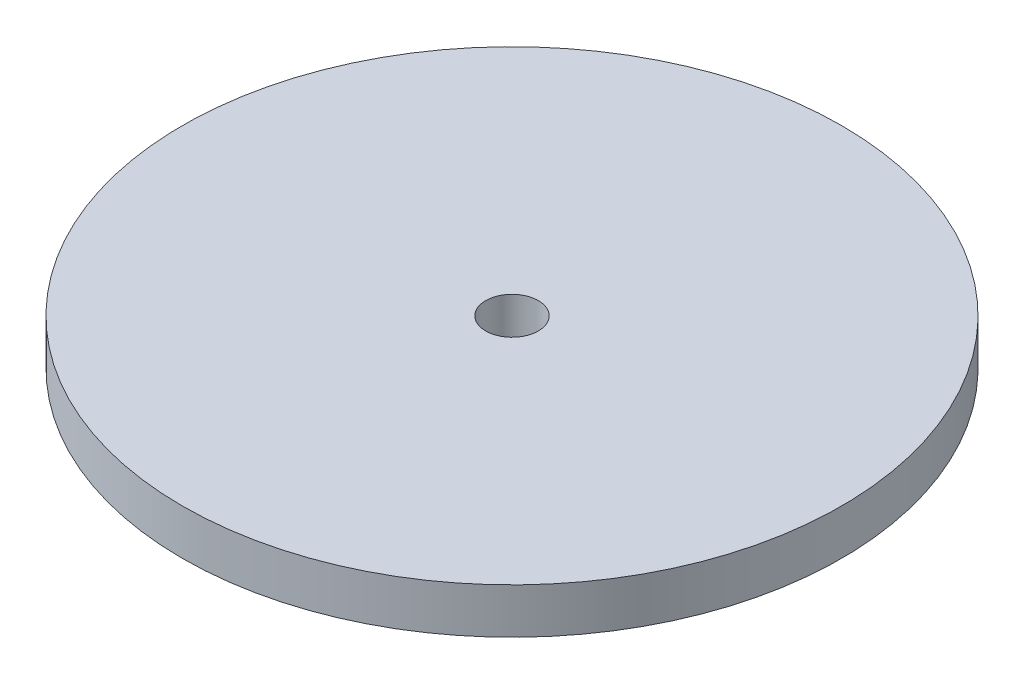
ISO-10303-21;
HEADER;
FILE_DESCRIPTION(('STEP AP214'),'2;1');
FILE_NAME('part.step','',(''),(''),'','','');
FILE_SCHEMA(('AUTOMOTIVE_DESIGN { 1 0 10303 214 1 1 1 1 }'));
ENDSEC;
DATA;
#1=APPLICATION_CONTEXT('core data for automotive mechanical design processes');
#2=APPLICATION_PROTOCOL_DEFINITION('international standard','automotive_design',2000,#1);
#3=PRODUCT_CONTEXT('',#1,'mechanical');
#4=PRODUCT('Part','Part','',(#3));
#5=PRODUCT_RELATED_PRODUCT_CATEGORY('part','',(#4));
#6=PRODUCT_DEFINITION_FORMATION('','',#4);
#7=PRODUCT_DEFINITION_CONTEXT('part definition',#1,'design');
#8=PRODUCT_DEFINITION('design','',#6,#7);
#9=PRODUCT_DEFINITION_SHAPE('','',#8);
#10=(LENGTH_UNIT() NAMED_UNIT(*) SI_UNIT(.MILLI.,.METRE.));
#11=(NAMED_UNIT(*) PLANE_ANGLE_UNIT() SI_UNIT($,.RADIAN.));
#12=(NAMED_UNIT(*) SI_UNIT($,.STERADIAN.) SOLID_ANGLE_UNIT());
#13=UNCERTAINTY_MEASURE_WITH_UNIT(LENGTH_MEASURE(1.E-05),#10,'distance_accuracy_value','');
#14=(GEOMETRIC_REPRESENTATION_CONTEXT(3) GLOBAL_UNCERTAINTY_ASSIGNED_CONTEXT((#13)) GLOBAL_UNIT_ASSIGNED_CONTEXT((#10,
#11,#12)) REPRESENTATION_CONTEXT('',''));
#15=CARTESIAN_POINT('',(0.,0.,0.));
#16=DIRECTION('',(0.,0.,1.));
#17=DIRECTION('',(1.,0.,0.));
#18=AXIS2_PLACEMENT_3D('',#15,#16,#17);
#19=CARTESIAN_POINT('',(0.,5.,0.));
#20=DIRECTION('',(0.,1.,0.));
#21=DIRECTION('',(0.,0.,1.));
#22=AXIS2_PLACEMENT_3D('',#19,#20,#21);
#23=PLANE('',#22);
#24=CARTESIAN_POINT('',(0.,5.,0.));
#25=DIRECTION('',(0.,1.,0.));
#26=DIRECTION('',(0.,0.,1.));
#27=AXIS2_PLACEMENT_3D('',#24,#25,#26);
#28=CIRCLE('',#27,36.3);
#29=CARTESIAN_POINT('',(0.,5.,36.3));
#30=VERTEX_POINT('',#29);
#31=EDGE_CURVE('E10',#30,#30,#28,.T.);
#32=ORIENTED_EDGE('',*,*,#31,.T.);
#33=EDGE_LOOP('',(#32));
#34=FACE_BOUND('',#33,.T.);
#35=CARTESIAN_POINT('',(0.,5.,0.));
#36=DIRECTION('',(0.,1.,0.));
#37=DIRECTION('',(0.,0.,1.));
#38=AXIS2_PLACEMENT_3D('',#35,#36,#37);
#39=CIRCLE('',#38,2.9);
#40=CARTESIAN_POINT('',(0.,5.,2.9));
#41=VERTEX_POINT('',#40);
#42=EDGE_CURVE('E50',#41,#41,#39,.T.);
#43=ORIENTED_EDGE('',*,*,#42,.F.);
#44=EDGE_LOOP('',(#43));
#45=FACE_BOUND('',#44,.T.);
#46=ADVANCED_FACE('F37',(#34,#45),#23,.T.);
#47=CARTESIAN_POINT('',(0.,0.,0.));
#48=DIRECTION('',(0.,1.,0.));
#49=DIRECTION('',(0.,0.,1.));
#50=AXIS2_PLACEMENT_3D('',#47,#48,#49);
#51=PLANE('',#50);
#52=CARTESIAN_POINT('',(0.,0.,0.));
#53=DIRECTION('',(0.,1.,0.));
#54=DIRECTION('',(0.,0.,1.));
#55=AXIS2_PLACEMENT_3D('',#52,#53,#54);
#56=CIRCLE('',#55,36.3);
#57=CARTESIAN_POINT('',(0.,0.,36.3));
#58=VERTEX_POINT('',#57);
#59=EDGE_CURVE('E41',#58,#58,#56,.T.);
#60=ORIENTED_EDGE('',*,*,#59,.F.);
#61=EDGE_LOOP('',(#60));
#62=FACE_BOUND('',#61,.T.);
#63=CARTESIAN_POINT('',(0.,0.,0.));
#64=DIRECTION('',(0.,1.,0.));
#65=DIRECTION('',(0.,0.,1.));
#66=AXIS2_PLACEMENT_3D('',#63,#64,#65);
#67=CIRCLE('',#66,2.9);
#68=CARTESIAN_POINT('',(0.,0.,2.9));
#69=VERTEX_POINT('',#68);
#70=EDGE_CURVE('E52',#69,#69,#67,.T.);
#71=ORIENTED_EDGE('',*,*,#70,.T.);
#72=EDGE_LOOP('',(#71));
#73=FACE_BOUND('',#72,.T.);
#74=ADVANCED_FACE('F64',(#62,#73),#51,.F.);
#75=CARTESIAN_POINT('',(0.,5.,0.));
#76=DIRECTION('',(0.,-1.,0.));
#77=DIRECTION('',(0.,0.,-1.));
#78=AXIS2_PLACEMENT_3D('',#75,#76,#77);
#79=CYLINDRICAL_SURFACE('',#78,36.3);
#80=ORIENTED_EDGE('',*,*,#31,.F.);
#81=EDGE_LOOP('',(#80));
#82=FACE_BOUND('',#81,.T.);
#83=ORIENTED_EDGE('',*,*,#59,.T.);
#84=EDGE_LOOP('',(#83));
#85=FACE_BOUND('',#84,.T.);
#86=ADVANCED_FACE('F39',(#82,#85),#79,.T.);
#87=CARTESIAN_POINT('',(0.,5.,0.));
#88=DIRECTION('',(0.,-1.,0.));
#89=DIRECTION('',(0.,0.,-1.));
#90=AXIS2_PLACEMENT_3D('',#87,#88,#89);
#91=CYLINDRICAL_SURFACE('',#90,2.9);
#92=ORIENTED_EDGE('',*,*,#42,.T.);
#93=EDGE_LOOP('',(#92));
#94=FACE_BOUND('',#93,.T.);
#95=ORIENTED_EDGE('',*,*,#70,.F.);
#96=EDGE_LOOP('',(#95));
#97=FACE_BOUND('',#96,.T.);
#98=ADVANCED_FACE('F60',(#94,#97),#91,.F.);
#99=CLOSED_SHELL('',(#46,#74,#86,#98));
#100=MANIFOLD_SOLID_BREP('B2',#99);
#101=ADVANCED_BREP_SHAPE_REPRESENTATION('',(#18,#100),#14);
#102=SHAPE_DEFINITION_REPRESENTATION(#9,#101);
ENDSEC;
END-ISO-10303-21;
